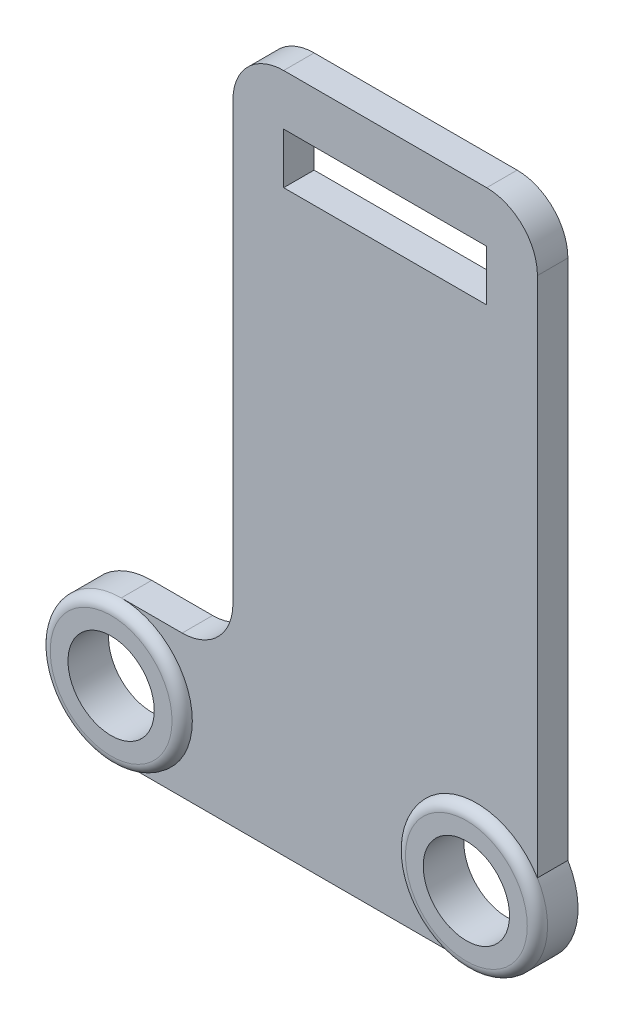
ISO-10303-21;
HEADER;
FILE_DESCRIPTION(('STEP AP214'),'2;1');
FILE_NAME('part.step','',(''),(''),'','','');
FILE_SCHEMA(('AUTOMOTIVE_DESIGN { 1 0 10303 214 1 1 1 1 }'));
ENDSEC;
DATA;
#1=APPLICATION_CONTEXT('core data for automotive mechanical design processes');
#2=APPLICATION_PROTOCOL_DEFINITION('international standard','automotive_design',2000,#1);
#3=PRODUCT_CONTEXT('',#1,'mechanical');
#4=PRODUCT('Part','Part','',(#3));
#5=PRODUCT_RELATED_PRODUCT_CATEGORY('part','',(#4));
#6=PRODUCT_DEFINITION_FORMATION('','',#4);
#7=PRODUCT_DEFINITION_CONTEXT('part definition',#1,'design');
#8=PRODUCT_DEFINITION('design','',#6,#7);
#9=PRODUCT_DEFINITION_SHAPE('','',#8);
#10=(LENGTH_UNIT() NAMED_UNIT(*) SI_UNIT(.MILLI.,.METRE.));
#11=(NAMED_UNIT(*) PLANE_ANGLE_UNIT() SI_UNIT($,.RADIAN.));
#12=(NAMED_UNIT(*) SI_UNIT($,.STERADIAN.) SOLID_ANGLE_UNIT());
#13=UNCERTAINTY_MEASURE_WITH_UNIT(LENGTH_MEASURE(1.E-05),#10,'distance_accuracy_value','');
#14=(GEOMETRIC_REPRESENTATION_CONTEXT(3) GLOBAL_UNCERTAINTY_ASSIGNED_CONTEXT((#13)) GLOBAL_UNIT_ASSIGNED_CONTEXT((#10,
#11,#12)) REPRESENTATION_CONTEXT('',''));
#15=CARTESIAN_POINT('',(0.,0.,0.));
#16=DIRECTION('',(0.,0.,1.));
#17=DIRECTION('',(1.,0.,0.));
#18=AXIS2_PLACEMENT_3D('',#15,#16,#17);
#19=CARTESIAN_POINT('',(-20.,-14.5,3.));
#20=DIRECTION('',(0.,0.,1.));
#21=DIRECTION('',(1.,0.,0.));
#22=AXIS2_PLACEMENT_3D('',#19,#20,#21);
#23=PLANE('',#22);
#24=DIRECTION('',(-1.,0.,0.));
#25=VECTOR('',#24,1.);
#26=CARTESIAN_POINT('',(-10.,28.5,3.));
#27=LINE('',#26,#25);
#28=CARTESIAN_POINT('',(10.,28.5,3.));
#29=VERTEX_POINT('',#28);
#30=CARTESIAN_POINT('',(-10.,28.5,3.));
#31=VERTEX_POINT('',#30);
#32=EDGE_CURVE('E187',#29,#31,#27,.T.);
#33=ORIENTED_EDGE('',*,*,#32,.F.);
#34=DIRECTION('',(0.,1.,0.));
#35=VECTOR('',#34,1.);
#36=CARTESIAN_POINT('',(10.,28.5,3.));
#37=LINE('',#36,#35);
#38=CARTESIAN_POINT('',(10.,23.5,3.));
#39=VERTEX_POINT('',#38);
#40=EDGE_CURVE('E185',#39,#29,#37,.T.);
#41=ORIENTED_EDGE('',*,*,#40,.F.);
#42=DIRECTION('',(1.,0.,0.));
#43=VECTOR('',#42,1.);
#44=CARTESIAN_POINT('',(-10.,23.5,3.));
#45=LINE('',#44,#43);
#46=CARTESIAN_POINT('',(-10.,23.5,3.));
#47=VERTEX_POINT('',#46);
#48=EDGE_CURVE('E192',#47,#39,#45,.T.);
#49=ORIENTED_EDGE('',*,*,#48,.F.);
#50=DIRECTION('',(0.,-1.,0.));
#51=VECTOR('',#50,1.);
#52=CARTESIAN_POINT('',(-10.,28.5,3.));
#53=LINE('',#52,#51);
#54=EDGE_CURVE('E190',#31,#47,#53,.T.);
#55=ORIENTED_EDGE('',*,*,#54,.F.);
#56=EDGE_LOOP('',(#33,#41,#49,#55));
#57=FACE_BOUND('',#56,.T.);
#58=DIRECTION('',(1.,0.,0.));
#59=VECTOR('',#58,1.);
#60=CARTESIAN_POINT('',(9.,-33.5,3.));
#61=LINE('',#60,#59);
#62=CARTESIAN_POINT('',(-26.,-33.5,3.));
#63=VERTEX_POINT('',#62);
#64=CARTESIAN_POINT('',(9.,-33.5,3.));
#65=VERTEX_POINT('',#64);
#66=EDGE_CURVE('E159',#63,#65,#61,.T.);
#67=ORIENTED_EDGE('',*,*,#66,.T.);
#68=CARTESIAN_POINT('',(9.,-26.5,3.));
#69=DIRECTION('',(0.,0.,1.));
#70=DIRECTION('',(1.,0.,0.));
#71=AXIS2_PLACEMENT_3D('',#68,#69,#70);
#72=CIRCLE('',#71,7.);
#73=CARTESIAN_POINT('',(15.,-22.894448724536,3.));
#74=VERTEX_POINT('',#73);
#75=EDGE_CURVE('E140',#74,#65,#72,.T.);
#76=ORIENTED_EDGE('',*,*,#75,.F.);
#77=DIRECTION('',(0.,1.,0.));
#78=VECTOR('',#77,1.);
#79=CARTESIAN_POINT('',(15.,-22.894448724536,3.));
#80=LINE('',#79,#78);
#81=CARTESIAN_POINT('',(15.,28.5,3.));
#82=VERTEX_POINT('',#81);
#83=EDGE_CURVE('E150',#74,#82,#80,.T.);
#84=ORIENTED_EDGE('',*,*,#83,.T.);
#85=CARTESIAN_POINT('',(9.99999999999999,28.5,3.));
#86=DIRECTION('',(0.,0.,1.));
#87=DIRECTION('',(1.,0.,0.));
#88=AXIS2_PLACEMENT_3D('',#85,#86,#87);
#89=CIRCLE('',#88,5.);
#90=CARTESIAN_POINT('',(9.99999999999996,33.5,3.));
#91=VERTEX_POINT('',#90);
#92=EDGE_CURVE('E158',#82,#91,#89,.T.);
#93=ORIENTED_EDGE('',*,*,#92,.T.);
#94=DIRECTION('',(-1.,0.,0.));
#95=VECTOR('',#94,1.);
#96=CARTESIAN_POINT('',(9.99999999999996,33.5,3.));
#97=LINE('',#96,#95);
#98=CARTESIAN_POINT('',(-9.99999999999997,33.5,3.));
#99=VERTEX_POINT('',#98);
#100=EDGE_CURVE('E220',#91,#99,#97,.T.);
#101=ORIENTED_EDGE('',*,*,#100,.T.);
#102=CARTESIAN_POINT('',(-10.,28.5,3.));
#103=DIRECTION('',(0.,0.,1.));
#104=DIRECTION('',(1.,0.,0.));
#105=AXIS2_PLACEMENT_3D('',#102,#103,#104);
#106=CIRCLE('',#105,5.);
#107=CARTESIAN_POINT('',(-15.,28.5,3.));
#108=VERTEX_POINT('',#107);
#109=EDGE_CURVE('E222',#99,#108,#106,.T.);
#110=ORIENTED_EDGE('',*,*,#109,.T.);
#111=DIRECTION('',(0.,-1.,0.));
#112=VECTOR('',#111,1.);
#113=CARTESIAN_POINT('',(-15.,-14.5,3.));
#114=LINE('',#113,#112);
#115=CARTESIAN_POINT('',(-15.,-14.5,3.));
#116=VERTEX_POINT('',#115);
#117=EDGE_CURVE('E224',#108,#116,#114,.T.);
#118=ORIENTED_EDGE('',*,*,#117,.T.);
#119=CARTESIAN_POINT('',(-20.,-14.5,3.));
#120=DIRECTION('',(0.,0.,-1.));
#121=DIRECTION('',(1.,0.,0.));
#122=AXIS2_PLACEMENT_3D('',#119,#120,#121);
#123=CIRCLE('',#122,5.);
#124=CARTESIAN_POINT('',(-20.,-19.5,3.));
#125=VERTEX_POINT('',#124);
#126=EDGE_CURVE('E211',#116,#125,#123,.T.);
#127=ORIENTED_EDGE('',*,*,#126,.T.);
#128=DIRECTION('',(-1.,0.,0.));
#129=VECTOR('',#128,1.);
#130=CARTESIAN_POINT('',(-26.,-19.5,3.));
#131=LINE('',#130,#129);
#132=CARTESIAN_POINT('',(-26.,-19.5,3.));
#133=VERTEX_POINT('',#132);
#134=EDGE_CURVE('E214',#125,#133,#131,.T.);
#135=ORIENTED_EDGE('',*,*,#134,.T.);
#136=CARTESIAN_POINT('',(-26.,-26.5,3.));
#137=DIRECTION('',(0.,0.,1.));
#138=DIRECTION('',(1.,0.,0.));
#139=AXIS2_PLACEMENT_3D('',#136,#137,#138);
#140=CIRCLE('',#139,7.);
#141=EDGE_CURVE('E177',#63,#133,#140,.T.);
#142=ORIENTED_EDGE('',*,*,#141,.F.);
#143=EDGE_LOOP('',(#67,#76,#84,#93,#101,#110,#118,#127,#135,#142));
#144=FACE_BOUND('',#143,.T.);
#145=ADVANCED_FACE('F33',(#57,#144),#23,.T.);
#146=CARTESIAN_POINT('',(-20.,-14.5,0.));
#147=DIRECTION('',(0.,0.,1.));
#148=DIRECTION('',(1.,0.,0.));
#149=AXIS2_PLACEMENT_3D('',#146,#147,#148);
#150=PLANE('',#149);
#151=CARTESIAN_POINT('',(-20.,-14.5,0.));
#152=DIRECTION('',(0.,0.,-1.));
#153=DIRECTION('',(1.,0.,0.));
#154=AXIS2_PLACEMENT_3D('',#151,#152,#153);
#155=CIRCLE('',#154,5.);
#156=CARTESIAN_POINT('',(-15.,-14.5,0.));
#157=VERTEX_POINT('',#156);
#158=CARTESIAN_POINT('',(-20.,-19.5,0.));
#159=VERTEX_POINT('',#158);
#160=EDGE_CURVE('E210',#157,#159,#155,.T.);
#161=ORIENTED_EDGE('',*,*,#160,.F.);
#162=DIRECTION('',(0.,-1.,0.));
#163=VECTOR('',#162,1.);
#164=CARTESIAN_POINT('',(-15.,-14.5,0.));
#165=LINE('',#164,#163);
#166=CARTESIAN_POINT('',(-15.,28.5,0.));
#167=VERTEX_POINT('',#166);
#168=EDGE_CURVE('E215',#167,#157,#165,.T.);
#169=ORIENTED_EDGE('',*,*,#168,.F.);
#170=CARTESIAN_POINT('',(-10.,28.5,0.));
#171=DIRECTION('',(0.,0.,1.));
#172=DIRECTION('',(1.,0.,0.));
#173=AXIS2_PLACEMENT_3D('',#170,#171,#172);
#174=CIRCLE('',#173,5.);
#175=CARTESIAN_POINT('',(-9.99999999999997,33.5,0.));
#176=VERTEX_POINT('',#175);
#177=EDGE_CURVE('E242',#176,#167,#174,.T.);
#178=ORIENTED_EDGE('',*,*,#177,.F.);
#179=DIRECTION('',(-1.,0.,0.));
#180=VECTOR('',#179,1.);
#181=CARTESIAN_POINT('',(9.99999999999996,33.5,0.));
#182=LINE('',#181,#180);
#183=CARTESIAN_POINT('',(9.99999999999996,33.5,0.));
#184=VERTEX_POINT('',#183);
#185=EDGE_CURVE('E240',#184,#176,#182,.T.);
#186=ORIENTED_EDGE('',*,*,#185,.F.);
#187=CARTESIAN_POINT('',(9.99999999999999,28.5,0.));
#188=DIRECTION('',(0.,0.,1.));
#189=DIRECTION('',(1.,0.,0.));
#190=AXIS2_PLACEMENT_3D('',#187,#188,#189);
#191=CIRCLE('',#190,5.);
#192=CARTESIAN_POINT('',(15.,28.5,0.));
#193=VERTEX_POINT('',#192);
#194=EDGE_CURVE('E238',#193,#184,#191,.T.);
#195=ORIENTED_EDGE('',*,*,#194,.F.);
#196=DIRECTION('',(0.,1.,0.));
#197=VECTOR('',#196,1.);
#198=CARTESIAN_POINT('',(15.,-22.894448724536,0.));
#199=LINE('',#198,#197);
#200=CARTESIAN_POINT('',(15.,-22.894448724536,0.));
#201=VERTEX_POINT('',#200);
#202=EDGE_CURVE('E236',#201,#193,#199,.T.);
#203=ORIENTED_EDGE('',*,*,#202,.F.);
#204=CARTESIAN_POINT('',(9.,-26.5,0.));
#205=DIRECTION('',(0.,0.,1.));
#206=DIRECTION('',(1.,0.,0.));
#207=AXIS2_PLACEMENT_3D('',#204,#205,#206);
#208=CIRCLE('',#207,7.);
#209=CARTESIAN_POINT('',(9.,-33.5,0.));
#210=VERTEX_POINT('',#209);
#211=EDGE_CURVE('E163',#210,#201,#208,.T.);
#212=ORIENTED_EDGE('',*,*,#211,.F.);
#213=DIRECTION('',(1.,0.,0.));
#214=VECTOR('',#213,1.);
#215=CARTESIAN_POINT('',(9.,-33.5,0.));
#216=LINE('',#215,#214);
#217=CARTESIAN_POINT('',(-26.,-33.5,0.));
#218=VERTEX_POINT('',#217);
#219=EDGE_CURVE('E233',#218,#210,#216,.T.);
#220=ORIENTED_EDGE('',*,*,#219,.F.);
#221=CARTESIAN_POINT('',(-26.,-26.5,0.));
#222=DIRECTION('',(0.,0.,1.));
#223=DIRECTION('',(1.,0.,0.));
#224=AXIS2_PLACEMENT_3D('',#221,#222,#223);
#225=CIRCLE('',#224,7.);
#226=CARTESIAN_POINT('',(-26.,-19.5,0.));
#227=VERTEX_POINT('',#226);
#228=EDGE_CURVE('E231',#227,#218,#225,.T.);
#229=ORIENTED_EDGE('',*,*,#228,.F.);
#230=DIRECTION('',(-1.,0.,0.));
#231=VECTOR('',#230,1.);
#232=CARTESIAN_POINT('',(-26.,-19.5,0.));
#233=LINE('',#232,#231);
#234=EDGE_CURVE('E229',#159,#227,#233,.T.);
#235=ORIENTED_EDGE('',*,*,#234,.F.);
#236=EDGE_LOOP('',(#161,#169,#178,#186,#195,#203,#212,#220,#229,#235));
#237=FACE_BOUND('',#236,.T.);
#238=DIRECTION('',(0.,1.,0.));
#239=VECTOR('',#238,1.);
#240=CARTESIAN_POINT('',(10.,28.5,0.));
#241=LINE('',#240,#239);
#242=CARTESIAN_POINT('',(10.,23.5,0.));
#243=VERTEX_POINT('',#242);
#244=CARTESIAN_POINT('',(10.,28.5,0.));
#245=VERTEX_POINT('',#244);
#246=EDGE_CURVE('E56',#243,#245,#241,.T.);
#247=ORIENTED_EDGE('',*,*,#246,.T.);
#248=DIRECTION('',(-1.,0.,0.));
#249=VECTOR('',#248,1.);
#250=CARTESIAN_POINT('',(-10.,28.5,0.));
#251=LINE('',#250,#249);
#252=CARTESIAN_POINT('',(-10.,28.5,0.));
#253=VERTEX_POINT('',#252);
#254=EDGE_CURVE('E196',#245,#253,#251,.T.);
#255=ORIENTED_EDGE('',*,*,#254,.T.);
#256=DIRECTION('',(0.,-1.,0.));
#257=VECTOR('',#256,1.);
#258=CARTESIAN_POINT('',(-10.,28.5,0.));
#259=LINE('',#258,#257);
#260=CARTESIAN_POINT('',(-10.,23.5,0.));
#261=VERTEX_POINT('',#260);
#262=EDGE_CURVE('E199',#253,#261,#259,.T.);
#263=ORIENTED_EDGE('',*,*,#262,.T.);
#264=DIRECTION('',(1.,0.,0.));
#265=VECTOR('',#264,1.);
#266=CARTESIAN_POINT('',(-10.,23.5,0.));
#267=LINE('',#266,#265);
#268=EDGE_CURVE('E188',#261,#243,#267,.T.);
#269=ORIENTED_EDGE('',*,*,#268,.T.);
#270=EDGE_LOOP('',(#247,#255,#263,#269));
#271=FACE_BOUND('',#270,.T.);
#272=CARTESIAN_POINT('',(9.,-26.5,0.));
#273=DIRECTION('',(0.,0.,1.));
#274=DIRECTION('',(1.,0.,0.));
#275=AXIS2_PLACEMENT_3D('',#272,#273,#274);
#276=CIRCLE('',#275,4.25);
#277=CARTESIAN_POINT('',(13.25,-26.5,0.));
#278=VERTEX_POINT('',#277);
#279=EDGE_CURVE('E182',#278,#278,#276,.T.);
#280=ORIENTED_EDGE('',*,*,#279,.T.);
#281=EDGE_LOOP('',(#280));
#282=FACE_BOUND('',#281,.T.);
#283=CARTESIAN_POINT('',(-26.,-26.5,0.));
#284=DIRECTION('',(0.,0.,1.));
#285=DIRECTION('',(1.,0.,0.));
#286=AXIS2_PLACEMENT_3D('',#283,#284,#285);
#287=CIRCLE('',#286,4.25);
#288=CARTESIAN_POINT('',(-21.75,-26.5,0.));
#289=VERTEX_POINT('',#288);
#290=EDGE_CURVE('E172',#289,#289,#287,.T.);
#291=ORIENTED_EDGE('',*,*,#290,.T.);
#292=EDGE_LOOP('',(#291));
#293=FACE_BOUND('',#292,.T.);
#294=ADVANCED_FACE('F280',(#237,#271,#282,#293),#150,.F.);
#295=CARTESIAN_POINT('',(-20.,-14.5,3.));
#296=DIRECTION('',(0.,0.,-1.));
#297=DIRECTION('',(-1.,0.,0.));
#298=AXIS2_PLACEMENT_3D('',#295,#296,#297);
#299=CYLINDRICAL_SURFACE('',#298,5.);
#300=ORIENTED_EDGE('',*,*,#160,.T.);
#301=DIRECTION('',(0.,0.,-1.));
#302=VECTOR('',#301,1.);
#303=CARTESIAN_POINT('',(-20.,-19.5,3.));
#304=LINE('',#303,#302);
#305=EDGE_CURVE('E179',#125,#159,#304,.T.);
#306=ORIENTED_EDGE('',*,*,#305,.F.);
#307=ORIENTED_EDGE('',*,*,#126,.F.);
#308=DIRECTION('',(0.,0.,-1.));
#309=VECTOR('',#308,1.);
#310=CARTESIAN_POINT('',(-15.,-14.5,3.));
#311=LINE('',#310,#309);
#312=EDGE_CURVE('E226',#116,#157,#311,.T.);
#313=ORIENTED_EDGE('',*,*,#312,.T.);
#314=EDGE_LOOP('',(#300,#306,#307,#313));
#315=FACE_BOUND('',#314,.T.);
#316=ADVANCED_FACE('F286',(#315),#299,.F.);
#317=CARTESIAN_POINT('',(-26.,-19.5,3.));
#318=DIRECTION('',(0.,-1.,0.));
#319=DIRECTION('',(0.,0.,-1.));
#320=AXIS2_PLACEMENT_3D('',#317,#318,#319);
#321=PLANE('',#320);
#322=ORIENTED_EDGE('',*,*,#234,.T.);
#323=DIRECTION('',(0.,0.,-1.));
#324=VECTOR('',#323,1.);
#325=CARTESIAN_POINT('',(-26.,-19.5,3.));
#326=LINE('',#325,#324);
#327=EDGE_CURVE('E261',#133,#227,#326,.T.);
#328=ORIENTED_EDGE('',*,*,#327,.F.);
#329=ORIENTED_EDGE('',*,*,#134,.F.);
#330=ORIENTED_EDGE('',*,*,#305,.T.);
#331=EDGE_LOOP('',(#322,#328,#329,#330));
#332=FACE_BOUND('',#331,.T.);
#333=ADVANCED_FACE('F321',(#332),#321,.F.);
#334=CARTESIAN_POINT('',(-26.,-26.5,3.));
#335=DIRECTION('',(0.,0.,-1.));
#336=DIRECTION('',(-1.,0.,0.));
#337=AXIS2_PLACEMENT_3D('',#334,#335,#336);
#338=CYLINDRICAL_SURFACE('',#337,7.);
#339=DIRECTION('',(0.,0.,-1.));
#340=VECTOR('',#339,1.);
#341=CARTESIAN_POINT('',(-26.,-33.5,3.));
#342=LINE('',#341,#340);
#343=EDGE_CURVE('E258',#63,#218,#342,.T.);
#344=ORIENTED_EDGE('',*,*,#343,.F.);
#345=CARTESIAN_POINT('',(-26.,-26.5,3.));
#346=DIRECTION('',(0.,0.,1.));
#347=DIRECTION('',(1.,0.,0.));
#348=AXIS2_PLACEMENT_3D('',#345,#346,#347);
#349=CIRCLE('',#348,7.);
#350=EDGE_CURVE('E11',#63,#133,#349,.F.);
#351=ORIENTED_EDGE('',*,*,#350,.T.);
#352=ORIENTED_EDGE('',*,*,#327,.T.);
#353=ORIENTED_EDGE('',*,*,#228,.T.);
#354=EDGE_LOOP('',(#344,#351,#352,#353));
#355=FACE_BOUND('',#354,.T.);
#356=ADVANCED_FACE('F317',(#355),#338,.T.);
#357=CARTESIAN_POINT('',(9.,-33.5,3.));
#358=DIRECTION('',(0.,1.,0.));
#359=DIRECTION('',(-1.,0.,0.));
#360=AXIS2_PLACEMENT_3D('',#357,#358,#359);
#361=PLANE('',#360);
#362=ORIENTED_EDGE('',*,*,#219,.T.);
#363=DIRECTION('',(0.,0.,-1.));
#364=VECTOR('',#363,1.);
#365=CARTESIAN_POINT('',(9.,-33.5,3.));
#366=LINE('',#365,#364);
#367=EDGE_CURVE('E164',#65,#210,#366,.T.);
#368=ORIENTED_EDGE('',*,*,#367,.F.);
#369=ORIENTED_EDGE('',*,*,#66,.F.);
#370=ORIENTED_EDGE('',*,*,#343,.T.);
#371=EDGE_LOOP('',(#362,#368,#369,#370));
#372=FACE_BOUND('',#371,.T.);
#373=ADVANCED_FACE('F314',(#372),#361,.F.);
#374=CARTESIAN_POINT('',(9.,-26.5,3.));
#375=DIRECTION('',(0.,0.,-1.));
#376=DIRECTION('',(-1.,0.,0.));
#377=AXIS2_PLACEMENT_3D('',#374,#375,#376);
#378=CYLINDRICAL_SURFACE('',#377,7.);
#379=DIRECTION('',(0.,0.,-1.));
#380=VECTOR('',#379,1.);
#381=CARTESIAN_POINT('',(15.,-22.894448724536,3.));
#382=LINE('',#381,#380);
#383=EDGE_CURVE('E152',#74,#201,#382,.T.);
#384=ORIENTED_EDGE('',*,*,#383,.F.);
#385=CARTESIAN_POINT('',(9.,-26.5,3.));
#386=DIRECTION('',(0.,0.,1.));
#387=DIRECTION('',(1.,0.,0.));
#388=AXIS2_PLACEMENT_3D('',#385,#386,#387);
#389=CIRCLE('',#388,7.);
#390=EDGE_CURVE('E135',#74,#65,#389,.F.);
#391=ORIENTED_EDGE('',*,*,#390,.T.);
#392=ORIENTED_EDGE('',*,*,#367,.T.);
#393=ORIENTED_EDGE('',*,*,#211,.T.);
#394=EDGE_LOOP('',(#384,#391,#392,#393));
#395=FACE_BOUND('',#394,.T.);
#396=ADVANCED_FACE('F161',(#395),#378,.T.);
#397=CARTESIAN_POINT('',(15.,-22.894448724536,3.));
#398=DIRECTION('',(-1.,0.,0.));
#399=DIRECTION('',(0.,0.,1.));
#400=AXIS2_PLACEMENT_3D('',#397,#398,#399);
#401=PLANE('',#400);
#402=ORIENTED_EDGE('',*,*,#202,.T.);
#403=DIRECTION('',(0.,0.,-1.));
#404=VECTOR('',#403,1.);
#405=CARTESIAN_POINT('',(15.,28.5,3.));
#406=LINE('',#405,#404);
#407=EDGE_CURVE('E155',#82,#193,#406,.T.);
#408=ORIENTED_EDGE('',*,*,#407,.F.);
#409=ORIENTED_EDGE('',*,*,#83,.F.);
#410=ORIENTED_EDGE('',*,*,#383,.T.);
#411=EDGE_LOOP('',(#402,#408,#409,#410));
#412=FACE_BOUND('',#411,.T.);
#413=ADVANCED_FACE('F151',(#412),#401,.F.);
#414=CARTESIAN_POINT('',(9.99999999999999,28.5,3.));
#415=DIRECTION('',(0.,0.,-1.));
#416=DIRECTION('',(-1.,0.,0.));
#417=AXIS2_PLACEMENT_3D('',#414,#415,#416);
#418=CYLINDRICAL_SURFACE('',#417,5.);
#419=ORIENTED_EDGE('',*,*,#194,.T.);
#420=DIRECTION('',(0.,0.,-1.));
#421=VECTOR('',#420,1.);
#422=CARTESIAN_POINT('',(9.99999999999996,33.5,3.));
#423=LINE('',#422,#421);
#424=EDGE_CURVE('E253',#91,#184,#423,.T.);
#425=ORIENTED_EDGE('',*,*,#424,.F.);
#426=ORIENTED_EDGE('',*,*,#92,.F.);
#427=ORIENTED_EDGE('',*,*,#407,.T.);
#428=EDGE_LOOP('',(#419,#425,#426,#427));
#429=FACE_BOUND('',#428,.T.);
#430=ADVANCED_FACE('F305',(#429),#418,.T.);
#431=CARTESIAN_POINT('',(9.99999999999996,33.5,3.));
#432=DIRECTION('',(0.,-1.,0.));
#433=DIRECTION('',(0.,0.,-1.));
#434=AXIS2_PLACEMENT_3D('',#431,#432,#433);
#435=PLANE('',#434);
#436=ORIENTED_EDGE('',*,*,#185,.T.);
#437=DIRECTION('',(0.,0.,-1.));
#438=VECTOR('',#437,1.);
#439=CARTESIAN_POINT('',(-9.99999999999997,33.5,3.));
#440=LINE('',#439,#438);
#441=EDGE_CURVE('E250',#99,#176,#440,.T.);
#442=ORIENTED_EDGE('',*,*,#441,.F.);
#443=ORIENTED_EDGE('',*,*,#100,.F.);
#444=ORIENTED_EDGE('',*,*,#424,.T.);
#445=EDGE_LOOP('',(#436,#442,#443,#444));
#446=FACE_BOUND('',#445,.T.);
#447=ADVANCED_FACE('F301',(#446),#435,.F.);
#448=CARTESIAN_POINT('',(-10.,28.5,3.));
#449=DIRECTION('',(0.,0.,-1.));
#450=DIRECTION('',(-1.,0.,0.));
#451=AXIS2_PLACEMENT_3D('',#448,#449,#450);
#452=CYLINDRICAL_SURFACE('',#451,5.);
#453=ORIENTED_EDGE('',*,*,#177,.T.);
#454=DIRECTION('',(0.,0.,-1.));
#455=VECTOR('',#454,1.);
#456=CARTESIAN_POINT('',(-15.,28.5,3.));
#457=LINE('',#456,#455);
#458=EDGE_CURVE('E247',#108,#167,#457,.T.);
#459=ORIENTED_EDGE('',*,*,#458,.F.);
#460=ORIENTED_EDGE('',*,*,#109,.F.);
#461=ORIENTED_EDGE('',*,*,#441,.T.);
#462=EDGE_LOOP('',(#453,#459,#460,#461));
#463=FACE_BOUND('',#462,.T.);
#464=ADVANCED_FACE('F297',(#463),#452,.T.);
#465=CARTESIAN_POINT('',(-15.,-14.5,3.));
#466=DIRECTION('',(1.,0.,0.));
#467=DIRECTION('',(0.,0.,-1.));
#468=AXIS2_PLACEMENT_3D('',#465,#466,#467);
#469=PLANE('',#468);
#470=ORIENTED_EDGE('',*,*,#168,.T.);
#471=ORIENTED_EDGE('',*,*,#312,.F.);
#472=ORIENTED_EDGE('',*,*,#117,.F.);
#473=ORIENTED_EDGE('',*,*,#458,.T.);
#474=EDGE_LOOP('',(#470,#471,#472,#473));
#475=FACE_BOUND('',#474,.T.);
#476=ADVANCED_FACE('F294',(#475),#469,.F.);
#477=CARTESIAN_POINT('',(10.,28.5,3.));
#478=DIRECTION('',(-1.,0.,0.));
#479=DIRECTION('',(0.,-1.,0.));
#480=AXIS2_PLACEMENT_3D('',#477,#478,#479);
#481=PLANE('',#480);
#482=ORIENTED_EDGE('',*,*,#246,.F.);
#483=DIRECTION('',(0.,0.,-1.));
#484=VECTOR('',#483,1.);
#485=CARTESIAN_POINT('',(10.,23.5,3.));
#486=LINE('',#485,#484);
#487=EDGE_CURVE('E194',#39,#243,#486,.T.);
#488=ORIENTED_EDGE('',*,*,#487,.F.);
#489=ORIENTED_EDGE('',*,*,#40,.T.);
#490=DIRECTION('',(0.,0.,-1.));
#491=VECTOR('',#490,1.);
#492=CARTESIAN_POINT('',(10.,28.5,3.));
#493=LINE('',#492,#491);
#494=EDGE_CURVE('E208',#29,#245,#493,.T.);
#495=ORIENTED_EDGE('',*,*,#494,.T.);
#496=EDGE_LOOP('',(#482,#488,#489,#495));
#497=FACE_BOUND('',#496,.T.);
#498=ADVANCED_FACE('F291',(#497),#481,.T.);
#499=CARTESIAN_POINT('',(-10.,28.5,3.));
#500=DIRECTION('',(0.,-1.,0.));
#501=DIRECTION('',(1.,0.,0.));
#502=AXIS2_PLACEMENT_3D('',#499,#500,#501);
#503=PLANE('',#502);
#504=ORIENTED_EDGE('',*,*,#254,.F.);
#505=ORIENTED_EDGE('',*,*,#494,.F.);
#506=ORIENTED_EDGE('',*,*,#32,.T.);
#507=DIRECTION('',(0.,0.,-1.));
#508=VECTOR('',#507,1.);
#509=CARTESIAN_POINT('',(-10.,28.5,3.));
#510=LINE('',#509,#508);
#511=EDGE_CURVE('E206',#31,#253,#510,.T.);
#512=ORIENTED_EDGE('',*,*,#511,.T.);
#513=EDGE_LOOP('',(#504,#505,#506,#512));
#514=FACE_BOUND('',#513,.T.);
#515=ADVANCED_FACE('F377',(#514),#503,.T.);
#516=CARTESIAN_POINT('',(-10.,28.5,3.));
#517=DIRECTION('',(1.,0.,0.));
#518=DIRECTION('',(0.,0.,-1.));
#519=AXIS2_PLACEMENT_3D('',#516,#517,#518);
#520=PLANE('',#519);
#521=ORIENTED_EDGE('',*,*,#262,.F.);
#522=ORIENTED_EDGE('',*,*,#511,.F.);
#523=ORIENTED_EDGE('',*,*,#54,.T.);
#524=DIRECTION('',(0.,0.,-1.));
#525=VECTOR('',#524,1.);
#526=CARTESIAN_POINT('',(-10.,23.5,3.));
#527=LINE('',#526,#525);
#528=EDGE_CURVE('E48',#47,#261,#527,.T.);
#529=ORIENTED_EDGE('',*,*,#528,.T.);
#530=EDGE_LOOP('',(#521,#522,#523,#529));
#531=FACE_BOUND('',#530,.T.);
#532=ADVANCED_FACE('F375',(#531),#520,.T.);
#533=CARTESIAN_POINT('',(-10.,23.5,3.));
#534=DIRECTION('',(0.,1.,0.));
#535=DIRECTION('',(0.,0.,1.));
#536=AXIS2_PLACEMENT_3D('',#533,#534,#535);
#537=PLANE('',#536);
#538=ORIENTED_EDGE('',*,*,#268,.F.);
#539=ORIENTED_EDGE('',*,*,#528,.F.);
#540=ORIENTED_EDGE('',*,*,#48,.T.);
#541=ORIENTED_EDGE('',*,*,#487,.T.);
#542=EDGE_LOOP('',(#538,#539,#540,#541));
#543=FACE_BOUND('',#542,.T.);
#544=ADVANCED_FACE('F371',(#543),#537,.T.);
#545=CARTESIAN_POINT('',(9.,-26.5,3.));
#546=DIRECTION('',(0.,0.,-1.));
#547=DIRECTION('',(-1.,0.,0.));
#548=AXIS2_PLACEMENT_3D('',#545,#546,#547);
#549=CYLINDRICAL_SURFACE('',#548,4.25);
#550=ORIENTED_EDGE('',*,*,#279,.F.);
#551=EDGE_LOOP('',(#550));
#552=FACE_BOUND('',#551,.T.);
#553=CARTESIAN_POINT('',(9.,-26.5,4.));
#554=DIRECTION('',(0.,0.,1.));
#555=DIRECTION('',(1.,0.,0.));
#556=AXIS2_PLACEMENT_3D('',#553,#554,#555);
#557=CIRCLE('',#556,4.25);
#558=CARTESIAN_POINT('',(13.25,-26.5,4.));
#559=VERTEX_POINT('',#558);
#560=EDGE_CURVE('E169',#559,#559,#557,.T.);
#561=ORIENTED_EDGE('',*,*,#560,.T.);
#562=EDGE_LOOP('',(#561));
#563=FACE_BOUND('',#562,.T.);
#564=ADVANCED_FACE('F358',(#552,#563),#549,.F.);
#565=CARTESIAN_POINT('',(-26.,-26.5,3.));
#566=DIRECTION('',(0.,0.,-1.));
#567=DIRECTION('',(-1.,0.,0.));
#568=AXIS2_PLACEMENT_3D('',#565,#566,#567);
#569=CYLINDRICAL_SURFACE('',#568,4.25);
#570=ORIENTED_EDGE('',*,*,#290,.F.);
#571=EDGE_LOOP('',(#570));
#572=FACE_BOUND('',#571,.T.);
#573=CARTESIAN_POINT('',(-26.,-26.5,4.));
#574=DIRECTION('',(0.,0.,1.));
#575=DIRECTION('',(1.,0.,0.));
#576=AXIS2_PLACEMENT_3D('',#573,#574,#575);
#577=CIRCLE('',#576,4.25);
#578=CARTESIAN_POINT('',(-21.75,-26.5,4.));
#579=VERTEX_POINT('',#578);
#580=EDGE_CURVE('E168',#579,#579,#577,.T.);
#581=ORIENTED_EDGE('',*,*,#580,.T.);
#582=EDGE_LOOP('',(#581));
#583=FACE_BOUND('',#582,.T.);
#584=ADVANCED_FACE('F355',(#572,#583),#569,.F.);
#585=CARTESIAN_POINT('',(-26.,-26.5,4.));
#586=DIRECTION('',(0.,0.,1.));
#587=DIRECTION('',(1.,0.,0.));
#588=AXIS2_PLACEMENT_3D('',#585,#586,#587);
#589=PLANE('',#588);
#590=CARTESIAN_POINT('',(-26.,-26.5,4.));
#591=DIRECTION('',(0.,0.,1.));
#592=DIRECTION('',(1.,0.,0.));
#593=AXIS2_PLACEMENT_3D('',#590,#591,#592);
#594=CIRCLE('',#593,6.);
#595=CARTESIAN_POINT('',(-20.,-26.5,4.));
#596=VERTEX_POINT('',#595);
#597=EDGE_CURVE('E41',#596,#596,#594,.T.);
#598=ORIENTED_EDGE('',*,*,#597,.T.);
#599=EDGE_LOOP('',(#598));
#600=FACE_BOUND('',#599,.T.);
#601=ORIENTED_EDGE('',*,*,#580,.F.);
#602=EDGE_LOOP('',(#601));
#603=FACE_BOUND('',#602,.T.);
#604=ADVANCED_FACE('F270',(#600,#603),#589,.T.);
#605=CARTESIAN_POINT('',(9.,-26.5,4.));
#606=DIRECTION('',(0.,0.,1.));
#607=DIRECTION('',(1.,0.,0.));
#608=AXIS2_PLACEMENT_3D('',#605,#606,#607);
#609=PLANE('',#608);
#610=CARTESIAN_POINT('',(9.,-26.5,4.));
#611=DIRECTION('',(0.,0.,1.));
#612=DIRECTION('',(1.,0.,0.));
#613=AXIS2_PLACEMENT_3D('',#610,#611,#612);
#614=CIRCLE('',#613,6.);
#615=CARTESIAN_POINT('',(15.,-26.5,4.));
#616=VERTEX_POINT('',#615);
#617=EDGE_CURVE('E145',#616,#616,#614,.T.);
#618=ORIENTED_EDGE('',*,*,#617,.T.);
#619=EDGE_LOOP('',(#618));
#620=FACE_BOUND('',#619,.T.);
#621=ORIENTED_EDGE('',*,*,#560,.F.);
#622=EDGE_LOOP('',(#621));
#623=FACE_BOUND('',#622,.T.);
#624=ADVANCED_FACE('F278',(#620,#623),#609,.T.);
#625=CARTESIAN_POINT('',(9.,-26.5,3.));
#626=DIRECTION('',(0.,0.,1.));
#627=DIRECTION('',(1.,0.,0.));
#628=AXIS2_PLACEMENT_3D('',#625,#626,#627);
#629=TOROIDAL_SURFACE('',#628,6.,1.);
#630=ORIENTED_EDGE('',*,*,#390,.F.);
#631=ORIENTED_EDGE('',*,*,#75,.T.);
#632=EDGE_LOOP('',(#630,#631));
#633=FACE_BOUND('',#632,.T.);
#634=ORIENTED_EDGE('',*,*,#617,.F.);
#635=EDGE_LOOP('',(#634));
#636=FACE_BOUND('',#635,.T.);
#637=ADVANCED_FACE('F137',(#633,#636),#629,.T.);
#638=CARTESIAN_POINT('',(-26.,-26.5,3.));
#639=DIRECTION('',(0.,0.,1.));
#640=DIRECTION('',(1.,0.,0.));
#641=AXIS2_PLACEMENT_3D('',#638,#639,#640);
#642=TOROIDAL_SURFACE('',#641,6.,1.);
#643=ORIENTED_EDGE('',*,*,#141,.T.);
#644=ORIENTED_EDGE('',*,*,#350,.F.);
#645=EDGE_LOOP('',(#643,#644));
#646=FACE_BOUND('',#645,.T.);
#647=ORIENTED_EDGE('',*,*,#597,.F.);
#648=EDGE_LOOP('',(#647));
#649=FACE_BOUND('',#648,.T.);
#650=ADVANCED_FACE('F35',(#646,#649),#642,.T.);
#651=CLOSED_SHELL('',(#145,#294,#316,#333,#356,#373,#396,#413,#430,#447,#464,#476,#498,#515,
#532,#544,#564,#584,#604,#624,#637,#650));
#652=MANIFOLD_SOLID_BREP('B2',#651);
#653=ADVANCED_BREP_SHAPE_REPRESENTATION('',(#18,#652),#14);
#654=SHAPE_DEFINITION_REPRESENTATION(#9,#653);
ENDSEC;
END-ISO-10303-21;
